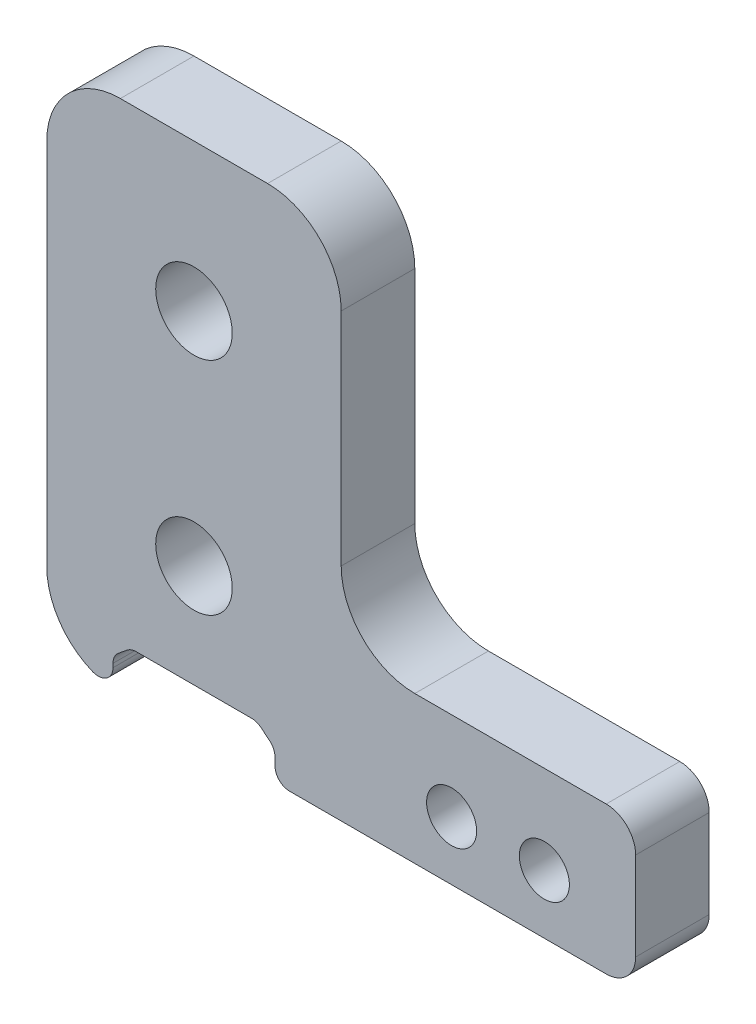
ISO-10303-21;
HEADER;
FILE_DESCRIPTION(('STEP AP214'),'2;1');
FILE_NAME('part.step','',(''),(''),'','','');
FILE_SCHEMA(('AUTOMOTIVE_DESIGN { 1 0 10303 214 1 1 1 1 }'));
ENDSEC;
DATA;
#1=APPLICATION_CONTEXT('core data for automotive mechanical design processes');
#2=APPLICATION_PROTOCOL_DEFINITION('international standard','automotive_design',2000,#1);
#3=PRODUCT_CONTEXT('',#1,'mechanical');
#4=PRODUCT('Part','Part','',(#3));
#5=PRODUCT_RELATED_PRODUCT_CATEGORY('part','',(#4));
#6=PRODUCT_DEFINITION_FORMATION('','',#4);
#7=PRODUCT_DEFINITION_CONTEXT('part definition',#1,'design');
#8=PRODUCT_DEFINITION('design','',#6,#7);
#9=PRODUCT_DEFINITION_SHAPE('','',#8);
#10=(LENGTH_UNIT() NAMED_UNIT(*) SI_UNIT(.MILLI.,.METRE.));
#11=(NAMED_UNIT(*) PLANE_ANGLE_UNIT() SI_UNIT($,.RADIAN.));
#12=(NAMED_UNIT(*) SI_UNIT($,.STERADIAN.) SOLID_ANGLE_UNIT());
#13=UNCERTAINTY_MEASURE_WITH_UNIT(LENGTH_MEASURE(1.E-05),#10,'distance_accuracy_value','');
#14=(GEOMETRIC_REPRESENTATION_CONTEXT(3) GLOBAL_UNCERTAINTY_ASSIGNED_CONTEXT((#13)) GLOBAL_UNIT_ASSIGNED_CONTEXT((#10,
#11,#12)) REPRESENTATION_CONTEXT('',''));
#15=CARTESIAN_POINT('',(0.,0.,0.));
#16=DIRECTION('',(0.,0.,1.));
#17=DIRECTION('',(1.,0.,0.));
#18=AXIS2_PLACEMENT_3D('',#15,#16,#17);
#19=CARTESIAN_POINT('',(0.,-35.,5.));
#20=DIRECTION('',(0.,1.,0.));
#21=DIRECTION('',(0.,0.,1.));
#22=AXIS2_PLACEMENT_3D('',#19,#20,#21);
#23=PLANE('',#22);
#24=DIRECTION('',(1.,0.,0.));
#25=VECTOR('',#24,1.);
#26=CARTESIAN_POINT('',(0.,-35.,0.));
#27=LINE('',#26,#25);
#28=CARTESIAN_POINT('',(16.5,-35.,0.));
#29=VERTEX_POINT('',#28);
#30=CARTESIAN_POINT('',(38.,-35.,0.));
#31=VERTEX_POINT('',#30);
#32=EDGE_CURVE('E224',#29,#31,#27,.T.);
#33=ORIENTED_EDGE('',*,*,#32,.T.);
#34=DIRECTION('',(0.,0.,-1.));
#35=VECTOR('',#34,1.);
#36=CARTESIAN_POINT('',(38.,-35.,5.));
#37=LINE('',#36,#35);
#38=CARTESIAN_POINT('',(38.,-35.,5.));
#39=VERTEX_POINT('',#38);
#40=EDGE_CURVE('E376',#31,#39,#37,.F.);
#41=ORIENTED_EDGE('',*,*,#40,.T.);
#42=DIRECTION('',(1.,0.,0.));
#43=VECTOR('',#42,1.);
#44=CARTESIAN_POINT('',(20.,-35.,5.));
#45=LINE('',#44,#43);
#46=CARTESIAN_POINT('',(16.5,-35.,5.));
#47=VERTEX_POINT('',#46);
#48=EDGE_CURVE('E255',#47,#39,#45,.T.);
#49=ORIENTED_EDGE('',*,*,#48,.F.);
#50=DIRECTION('',(0.,0.,-1.));
#51=VECTOR('',#50,1.);
#52=CARTESIAN_POINT('',(16.5,-35.,0.));
#53=LINE('',#52,#51);
#54=EDGE_CURVE('E231',#47,#29,#53,.T.);
#55=ORIENTED_EDGE('',*,*,#54,.T.);
#56=EDGE_LOOP('',(#33,#41,#49,#55));
#57=FACE_BOUND('',#56,.T.);
#58=ADVANCED_FACE('F43',(#57),#23,.F.);
#59=CARTESIAN_POINT('',(0.,0.,5.));
#60=DIRECTION('',(0.,1.,0.));
#61=DIRECTION('',(0.,0.,1.));
#62=AXIS2_PLACEMENT_3D('',#59,#60,#61);
#63=PLANE('',#62);
#64=DIRECTION('',(1.,0.,0.));
#65=VECTOR('',#64,1.);
#66=CARTESIAN_POINT('',(0.,0.,0.));
#67=LINE('',#66,#65);
#68=CARTESIAN_POINT('',(5.,0.,0.));
#69=VERTEX_POINT('',#68);
#70=CARTESIAN_POINT('',(15.,0.,0.));
#71=VERTEX_POINT('',#70);
#72=EDGE_CURVE('E434',#69,#71,#67,.T.);
#73=ORIENTED_EDGE('',*,*,#72,.F.);
#74=DIRECTION('',(0.,0.,-1.));
#75=VECTOR('',#74,1.);
#76=CARTESIAN_POINT('',(5.,0.,5.));
#77=LINE('',#76,#75);
#78=CARTESIAN_POINT('',(5.,0.,5.));
#79=VERTEX_POINT('',#78);
#80=EDGE_CURVE('E353',#69,#79,#77,.F.);
#81=ORIENTED_EDGE('',*,*,#80,.T.);
#82=DIRECTION('',(1.,0.,0.));
#83=VECTOR('',#82,1.);
#84=CARTESIAN_POINT('',(0.,0.,5.));
#85=LINE('',#84,#83);
#86=CARTESIAN_POINT('',(15.,0.,5.));
#87=VERTEX_POINT('',#86);
#88=EDGE_CURVE('E446',#79,#87,#85,.T.);
#89=ORIENTED_EDGE('',*,*,#88,.T.);
#90=DIRECTION('',(0.,0.,-1.));
#91=VECTOR('',#90,1.);
#92=CARTESIAN_POINT('',(15.,0.,5.));
#93=LINE('',#92,#91);
#94=EDGE_CURVE('E349',#87,#71,#93,.T.);
#95=ORIENTED_EDGE('',*,*,#94,.T.);
#96=EDGE_LOOP('',(#73,#81,#89,#95));
#97=FACE_BOUND('',#96,.T.);
#98=ADVANCED_FACE('F499',(#97),#63,.T.);
#99=CARTESIAN_POINT('',(0.,0.,5.));
#100=DIRECTION('',(1.,0.,0.));
#101=DIRECTION('',(0.,1.,0.));
#102=AXIS2_PLACEMENT_3D('',#99,#100,#101);
#103=PLANE('',#102);
#104=DIRECTION('',(0.,-1.,0.));
#105=VECTOR('',#104,1.);
#106=CARTESIAN_POINT('',(0.,0.,0.));
#107=LINE('',#106,#105);
#108=CARTESIAN_POINT('',(0.,-5.,0.));
#109=VERTEX_POINT('',#108);
#110=CARTESIAN_POINT('',(0.,-30.0250628144669,0.));
#111=VERTEX_POINT('',#110);
#112=EDGE_CURVE('E258',#109,#111,#107,.T.);
#113=ORIENTED_EDGE('',*,*,#112,.T.);
#114=DIRECTION('',(0.,0.,1.));
#115=VECTOR('',#114,1.);
#116=CARTESIAN_POINT('',(0.,-30.0250628144669,5.));
#117=LINE('',#116,#115);
#118=CARTESIAN_POINT('',(0.,-30.0250628144669,5.));
#119=VERTEX_POINT('',#118);
#120=EDGE_CURVE('E337',#111,#119,#117,.T.);
#121=ORIENTED_EDGE('',*,*,#120,.T.);
#122=DIRECTION('',(0.,-1.,0.));
#123=VECTOR('',#122,1.);
#124=CARTESIAN_POINT('',(0.,0.,5.));
#125=LINE('',#124,#123);
#126=CARTESIAN_POINT('',(0.,-5.,5.));
#127=VERTEX_POINT('',#126);
#128=EDGE_CURVE('E248',#127,#119,#125,.T.);
#129=ORIENTED_EDGE('',*,*,#128,.F.);
#130=DIRECTION('',(0.,0.,-1.));
#131=VECTOR('',#130,1.);
#132=CARTESIAN_POINT('',(0.,-5.,0.));
#133=LINE('',#132,#131);
#134=EDGE_CURVE('E333',#127,#109,#133,.T.);
#135=ORIENTED_EDGE('',*,*,#134,.T.);
#136=EDGE_LOOP('',(#113,#121,#129,#135));
#137=FACE_BOUND('',#136,.T.);
#138=ADVANCED_FACE('F485',(#137),#103,.F.);
#139=CARTESIAN_POINT('',(40.,-35.,5.));
#140=DIRECTION('',(-1.,0.,0.));
#141=DIRECTION('',(0.,0.,1.));
#142=AXIS2_PLACEMENT_3D('',#139,#140,#141);
#143=PLANE('',#142);
#144=DIRECTION('',(0.,1.,0.));
#145=VECTOR('',#144,1.);
#146=CARTESIAN_POINT('',(40.,-35.,5.));
#147=LINE('',#146,#145);
#148=CARTESIAN_POINT('',(40.,-33.,5.));
#149=VERTEX_POINT('',#148);
#150=CARTESIAN_POINT('',(40.,-27.,5.));
#151=VERTEX_POINT('',#150);
#152=EDGE_CURVE('E457',#149,#151,#147,.T.);
#153=ORIENTED_EDGE('',*,*,#152,.F.);
#154=DIRECTION('',(0.,0.,-1.));
#155=VECTOR('',#154,1.);
#156=CARTESIAN_POINT('',(40.,-33.,5.));
#157=LINE('',#156,#155);
#158=CARTESIAN_POINT('',(40.,-33.,0.));
#159=VERTEX_POINT('',#158);
#160=EDGE_CURVE('E366',#149,#159,#157,.T.);
#161=ORIENTED_EDGE('',*,*,#160,.T.);
#162=DIRECTION('',(0.,1.,0.));
#163=VECTOR('',#162,1.);
#164=CARTESIAN_POINT('',(40.,-35.,0.));
#165=LINE('',#164,#163);
#166=CARTESIAN_POINT('',(40.,-27.,0.));
#167=VERTEX_POINT('',#166);
#168=EDGE_CURVE('E474',#159,#167,#165,.T.);
#169=ORIENTED_EDGE('',*,*,#168,.T.);
#170=DIRECTION('',(0.,0.,-1.));
#171=VECTOR('',#170,1.);
#172=CARTESIAN_POINT('',(40.,-27.,5.));
#173=LINE('',#172,#171);
#174=EDGE_CURVE('E363',#167,#151,#173,.F.);
#175=ORIENTED_EDGE('',*,*,#174,.T.);
#176=EDGE_LOOP('',(#153,#161,#169,#175));
#177=FACE_BOUND('',#176,.T.);
#178=ADVANCED_FACE('F509',(#177),#143,.F.);
#179=CARTESIAN_POINT('',(40.,-25.,5.));
#180=DIRECTION('',(0.,-1.,0.));
#181=DIRECTION('',(1.,0.,0.));
#182=AXIS2_PLACEMENT_3D('',#179,#180,#181);
#183=PLANE('',#182);
#184=DIRECTION('',(-1.,0.,0.));
#185=VECTOR('',#184,1.);
#186=CARTESIAN_POINT('',(40.,-25.,5.));
#187=LINE('',#186,#185);
#188=CARTESIAN_POINT('',(38.,-25.,5.));
#189=VERTEX_POINT('',#188);
#190=CARTESIAN_POINT('',(25.,-25.,5.));
#191=VERTEX_POINT('',#190);
#192=EDGE_CURVE('E454',#189,#191,#187,.T.);
#193=ORIENTED_EDGE('',*,*,#192,.F.);
#194=DIRECTION('',(0.,0.,-1.));
#195=VECTOR('',#194,1.);
#196=CARTESIAN_POINT('',(38.,-25.,5.));
#197=LINE('',#196,#195);
#198=CARTESIAN_POINT('',(38.,-25.,0.));
#199=VERTEX_POINT('',#198);
#200=EDGE_CURVE('E385',#189,#199,#197,.T.);
#201=ORIENTED_EDGE('',*,*,#200,.T.);
#202=DIRECTION('',(-1.,0.,0.));
#203=VECTOR('',#202,1.);
#204=CARTESIAN_POINT('',(40.,-25.,0.));
#205=LINE('',#204,#203);
#206=CARTESIAN_POINT('',(25.,-25.,0.));
#207=VERTEX_POINT('',#206);
#208=EDGE_CURVE('E471',#199,#207,#205,.T.);
#209=ORIENTED_EDGE('',*,*,#208,.T.);
#210=DIRECTION('',(0.,0.,-1.));
#211=VECTOR('',#210,1.);
#212=CARTESIAN_POINT('',(25.,-25.,5.));
#213=LINE('',#212,#211);
#214=EDGE_CURVE('E320',#207,#191,#213,.F.);
#215=ORIENTED_EDGE('',*,*,#214,.T.);
#216=EDGE_LOOP('',(#193,#201,#209,#215));
#217=FACE_BOUND('',#216,.T.);
#218=ADVANCED_FACE('F512',(#217),#183,.F.);
#219=CARTESIAN_POINT('',(20.,0.,5.));
#220=DIRECTION('',(1.,0.,0.));
#221=DIRECTION('',(0.,1.,0.));
#222=AXIS2_PLACEMENT_3D('',#219,#220,#221);
#223=PLANE('',#222);
#224=DIRECTION('',(0.,-1.,0.));
#225=VECTOR('',#224,1.);
#226=CARTESIAN_POINT('',(20.,0.,5.));
#227=LINE('',#226,#225);
#228=CARTESIAN_POINT('',(20.,-5.,5.));
#229=VERTEX_POINT('',#228);
#230=CARTESIAN_POINT('',(20.,-20.,5.));
#231=VERTEX_POINT('',#230);
#232=EDGE_CURVE('E450',#229,#231,#227,.T.);
#233=ORIENTED_EDGE('',*,*,#232,.T.);
#234=DIRECTION('',(0.,0.,-1.));
#235=VECTOR('',#234,1.);
#236=CARTESIAN_POINT('',(20.,-20.,5.));
#237=LINE('',#236,#235);
#238=CARTESIAN_POINT('',(20.,-20.,0.));
#239=VERTEX_POINT('',#238);
#240=EDGE_CURVE('E316',#231,#239,#237,.T.);
#241=ORIENTED_EDGE('',*,*,#240,.T.);
#242=DIRECTION('',(0.,-1.,0.));
#243=VECTOR('',#242,1.);
#244=CARTESIAN_POINT('',(20.,0.,0.));
#245=LINE('',#244,#243);
#246=CARTESIAN_POINT('',(20.,-5.,0.));
#247=VERTEX_POINT('',#246);
#248=EDGE_CURVE('E467',#247,#239,#245,.T.);
#249=ORIENTED_EDGE('',*,*,#248,.F.);
#250=DIRECTION('',(0.,0.,-1.));
#251=VECTOR('',#250,1.);
#252=CARTESIAN_POINT('',(20.,-5.,5.));
#253=LINE('',#252,#251);
#254=EDGE_CURVE('E313',#247,#229,#253,.F.);
#255=ORIENTED_EDGE('',*,*,#254,.T.);
#256=EDGE_LOOP('',(#233,#241,#249,#255));
#257=FACE_BOUND('',#256,.T.);
#258=ADVANCED_FACE('F516',(#257),#223,.T.);
#259=CARTESIAN_POINT('',(0.,0.,5.));
#260=DIRECTION('',(0.,0.,-1.));
#261=DIRECTION('',(-1.,0.,0.));
#262=AXIS2_PLACEMENT_3D('',#259,#260,#261);
#263=PLANE('',#262);
#264=CARTESIAN_POINT('',(27.5,-31.,5.));
#265=DIRECTION('',(0.,0.,-1.));
#266=DIRECTION('',(-1.,0.,0.));
#267=AXIS2_PLACEMENT_3D('',#264,#265,#266);
#268=CIRCLE('',#267,1.7);
#269=CARTESIAN_POINT('',(25.8,-31.,5.));
#270=VERTEX_POINT('',#269);
#271=EDGE_CURVE('E418',#270,#270,#268,.F.);
#272=ORIENTED_EDGE('',*,*,#271,.F.);
#273=EDGE_LOOP('',(#272));
#274=FACE_BOUND('',#273,.T.);
#275=CARTESIAN_POINT('',(33.8,-31.,5.));
#276=DIRECTION('',(0.,0.,-1.));
#277=DIRECTION('',(-1.,0.,0.));
#278=AXIS2_PLACEMENT_3D('',#275,#276,#277);
#279=CIRCLE('',#278,1.7);
#280=CARTESIAN_POINT('',(32.1,-31.,5.));
#281=VERTEX_POINT('',#280);
#282=EDGE_CURVE('E419',#281,#281,#279,.F.);
#283=ORIENTED_EDGE('',*,*,#282,.F.);
#284=EDGE_LOOP('',(#283));
#285=FACE_BOUND('',#284,.T.);
#286=CARTESIAN_POINT('',(10.,-10.,5.));
#287=DIRECTION('',(0.,0.,-1.));
#288=DIRECTION('',(-1.,0.,0.));
#289=AXIS2_PLACEMENT_3D('',#286,#287,#288);
#290=CIRCLE('',#289,2.6);
#291=CARTESIAN_POINT('',(7.4,-10.,5.));
#292=VERTEX_POINT('',#291);
#293=EDGE_CURVE('E430',#292,#292,#290,.T.);
#294=ORIENTED_EDGE('',*,*,#293,.T.);
#295=EDGE_LOOP('',(#294));
#296=FACE_BOUND('',#295,.T.);
#297=CARTESIAN_POINT('',(10.,-25.,5.));
#298=DIRECTION('',(0.,0.,-1.));
#299=DIRECTION('',(-1.,0.,0.));
#300=AXIS2_PLACEMENT_3D('',#297,#298,#299);
#301=CIRCLE('',#300,2.6);
#302=CARTESIAN_POINT('',(7.4,-25.,5.));
#303=VERTEX_POINT('',#302);
#304=EDGE_CURVE('E423',#303,#303,#301,.T.);
#305=ORIENTED_EDGE('',*,*,#304,.T.);
#306=EDGE_LOOP('',(#305));
#307=FACE_BOUND('',#306,.T.);
#308=CARTESIAN_POINT('',(5.,-30.0250628144669,5.));
#309=DIRECTION('',(0.,0.,-1.));
#310=DIRECTION('',(-1.,0.,0.));
#311=AXIS2_PLACEMENT_3D('',#308,#309,#310);
#312=CIRCLE('',#311,5.);
#313=CARTESIAN_POINT('',(3.125,-34.6601868689017,5.));
#314=VERTEX_POINT('',#313);
#315=EDGE_CURVE('E346',#119,#314,#312,.F.);
#316=ORIENTED_EDGE('',*,*,#315,.T.);
#317=CARTESIAN_POINT('',(3.5,-33.7331620580147,5.));
#318=DIRECTION('',(0.,0.,-1.));
#319=DIRECTION('',(-1.,0.,0.));
#320=AXIS2_PLACEMENT_3D('',#317,#318,#319);
#321=CIRCLE('',#320,1.);
#322=CARTESIAN_POINT('',(4.5,-33.7331620580147,5.));
#323=VERTEX_POINT('',#322);
#324=EDGE_CURVE('E11',#314,#323,#321,.F.);
#325=ORIENTED_EDGE('',*,*,#324,.T.);
#326=DIRECTION('',(0.,-1.,0.));
#327=VECTOR('',#326,1.);
#328=CARTESIAN_POINT('',(4.5,-35.,5.));
#329=LINE('',#328,#327);
#330=CARTESIAN_POINT('',(4.5,-33.4749141008561,5.));
#331=VERTEX_POINT('',#330);
#332=EDGE_CURVE('E400',#331,#323,#329,.T.);
#333=ORIENTED_EDGE('',*,*,#332,.F.);
#334=CARTESIAN_POINT('',(5.5,-33.4749141008561,5.));
#335=DIRECTION('',(0.,0.,-1.));
#336=DIRECTION('',(-1.,0.,0.));
#337=AXIS2_PLACEMENT_3D('',#334,#335,#336);
#338=CIRCLE('',#337,1.);
#339=CARTESIAN_POINT('',(4.86807085347532,-32.6998879375735,5.));
#340=VERTEX_POINT('',#339);
#341=EDGE_CURVE('E310',#331,#340,#338,.T.);
#342=ORIENTED_EDGE('',*,*,#341,.T.);
#343=DIRECTION('',(-0.77502616328263,-0.631929146524677,0.));
#344=VECTOR('',#343,1.);
#345=CARTESIAN_POINT('',(4.5,-33.,5.));
#346=LINE('',#345,#344);
#347=CARTESIAN_POINT('',(5.45052674350594,-32.2249738367174,5.));
#348=VERTEX_POINT('',#347);
#349=EDGE_CURVE('E584',#348,#340,#346,.T.);
#350=ORIENTED_EDGE('',*,*,#349,.F.);
#351=CARTESIAN_POINT('',(6.08245589003062,-33.,5.));
#352=DIRECTION('',(0.,0.,-1.));
#353=DIRECTION('',(-1.,0.,0.));
#354=AXIS2_PLACEMENT_3D('',#351,#352,#353);
#355=CIRCLE('',#354,1.);
#356=CARTESIAN_POINT('',(6.08245589003062,-32.,5.));
#357=VERTEX_POINT('',#356);
#358=EDGE_CURVE('E303',#348,#357,#355,.T.);
#359=ORIENTED_EDGE('',*,*,#358,.T.);
#360=DIRECTION('',(-1.,0.,0.));
#361=VECTOR('',#360,1.);
#362=CARTESIAN_POINT('',(5.72644471701443,-32.,5.));
#363=LINE('',#362,#361);
#364=CARTESIAN_POINT('',(13.9175441099694,-32.,5.));
#365=VERTEX_POINT('',#364);
#366=EDGE_CURVE('E406',#365,#357,#363,.T.);
#367=ORIENTED_EDGE('',*,*,#366,.F.);
#368=CARTESIAN_POINT('',(13.9175441099694,-33.,5.));
#369=DIRECTION('',(0.,0.,-1.));
#370=DIRECTION('',(-1.,0.,0.));
#371=AXIS2_PLACEMENT_3D('',#368,#369,#370);
#372=CIRCLE('',#371,1.);
#373=CARTESIAN_POINT('',(14.549473256494,-32.2249738367174,5.));
#374=VERTEX_POINT('',#373);
#375=EDGE_CURVE('E297',#365,#374,#372,.T.);
#376=ORIENTED_EDGE('',*,*,#375,.T.);
#377=DIRECTION('',(-0.77502616328263,0.631929146524677,0.));
#378=VECTOR('',#377,1.);
#379=CARTESIAN_POINT('',(14.2735552829856,-32.,5.));
#380=LINE('',#379,#378);
#381=CARTESIAN_POINT('',(15.1319291465247,-32.6998879375735,5.));
#382=VERTEX_POINT('',#381);
#383=EDGE_CURVE('E585',#382,#374,#380,.T.);
#384=ORIENTED_EDGE('',*,*,#383,.F.);
#385=CARTESIAN_POINT('',(14.5,-33.4749141008561,5.));
#386=DIRECTION('',(0.,0.,-1.));
#387=DIRECTION('',(-1.,0.,0.));
#388=AXIS2_PLACEMENT_3D('',#385,#386,#387);
#389=CIRCLE('',#388,1.);
#390=CARTESIAN_POINT('',(15.5,-33.4749141008561,5.));
#391=VERTEX_POINT('',#390);
#392=EDGE_CURVE('E291',#382,#391,#389,.T.);
#393=ORIENTED_EDGE('',*,*,#392,.T.);
#394=DIRECTION('',(0.,-1.,0.));
#395=VECTOR('',#394,1.);
#396=CARTESIAN_POINT('',(15.5,-35.,5.));
#397=LINE('',#396,#395);
#398=CARTESIAN_POINT('',(15.5,-34.,5.));
#399=VERTEX_POINT('',#398);
#400=EDGE_CURVE('E580',#391,#399,#397,.T.);
#401=ORIENTED_EDGE('',*,*,#400,.T.);
#402=CARTESIAN_POINT('',(16.5,-34.,5.));
#403=DIRECTION('',(0.,0.,-1.));
#404=DIRECTION('',(-1.,0.,0.));
#405=AXIS2_PLACEMENT_3D('',#402,#403,#404);
#406=CIRCLE('',#405,1.);
#407=EDGE_CURVE('E230',#399,#47,#406,.F.);
#408=ORIENTED_EDGE('',*,*,#407,.T.);
#409=ORIENTED_EDGE('',*,*,#48,.T.);
#410=CARTESIAN_POINT('',(38.,-33.,5.));
#411=DIRECTION('',(0.,0.,-1.));
#412=DIRECTION('',(-1.,0.,0.));
#413=AXIS2_PLACEMENT_3D('',#410,#411,#412);
#414=CIRCLE('',#413,2.);
#415=EDGE_CURVE('E382',#39,#149,#414,.F.);
#416=ORIENTED_EDGE('',*,*,#415,.T.);
#417=ORIENTED_EDGE('',*,*,#152,.T.);
#418=CARTESIAN_POINT('',(38.,-27.,5.));
#419=DIRECTION('',(0.,0.,-1.));
#420=DIRECTION('',(-1.,0.,0.));
#421=AXIS2_PLACEMENT_3D('',#418,#419,#420);
#422=CIRCLE('',#421,2.);
#423=EDGE_CURVE('E379',#151,#189,#422,.F.);
#424=ORIENTED_EDGE('',*,*,#423,.T.);
#425=ORIENTED_EDGE('',*,*,#192,.T.);
#426=CARTESIAN_POINT('',(25.,-20.,5.));
#427=DIRECTION('',(0.,0.,-1.));
#428=DIRECTION('',(-1.,0.,0.));
#429=AXIS2_PLACEMENT_3D('',#426,#427,#428);
#430=CIRCLE('',#429,5.);
#431=EDGE_CURVE('E360',#191,#231,#430,.T.);
#432=ORIENTED_EDGE('',*,*,#431,.T.);
#433=ORIENTED_EDGE('',*,*,#232,.F.);
#434=CARTESIAN_POINT('',(15.,-5.,5.));
#435=DIRECTION('',(0.,0.,-1.));
#436=DIRECTION('',(-1.,0.,0.));
#437=AXIS2_PLACEMENT_3D('',#434,#435,#436);
#438=CIRCLE('',#437,5.);
#439=EDGE_CURVE('E340',#229,#87,#438,.F.);
#440=ORIENTED_EDGE('',*,*,#439,.T.);
#441=ORIENTED_EDGE('',*,*,#88,.F.);
#442=CARTESIAN_POINT('',(5.,-5.,5.));
#443=DIRECTION('',(0.,0.,-1.));
#444=DIRECTION('',(-1.,0.,0.));
#445=AXIS2_PLACEMENT_3D('',#442,#443,#444);
#446=CIRCLE('',#445,5.);
#447=EDGE_CURVE('E343',#79,#127,#446,.F.);
#448=ORIENTED_EDGE('',*,*,#447,.T.);
#449=ORIENTED_EDGE('',*,*,#128,.T.);
#450=EDGE_LOOP('',(#316,#325,#333,#342,#350,#359,#367,#376,#384,#393,#401,#408,#409,#416,#417,
#424,#425,#432,#433,#440,#441,#448,#449));
#451=FACE_BOUND('',#450,.T.);
#452=ADVANCED_FACE('F490',(#274,#285,#296,#307,#451),#263,.F.);
#453=CARTESIAN_POINT('',(0.,0.,0.));
#454=DIRECTION('',(0.,0.,-1.));
#455=DIRECTION('',(-1.,0.,0.));
#456=AXIS2_PLACEMENT_3D('',#453,#454,#455);
#457=PLANE('',#456);
#458=DIRECTION('',(0.,1.,0.));
#459=VECTOR('',#458,1.);
#460=CARTESIAN_POINT('',(4.5,-35.,0.));
#461=LINE('',#460,#459);
#462=CARTESIAN_POINT('',(4.5,-33.7331620580147,0.));
#463=VERTEX_POINT('',#462);
#464=CARTESIAN_POINT('',(4.5,-33.4749141008561,0.));
#465=VERTEX_POINT('',#464);
#466=EDGE_CURVE('E242',#463,#465,#461,.T.);
#467=ORIENTED_EDGE('',*,*,#466,.F.);
#468=CARTESIAN_POINT('',(3.5,-33.7331620580147,0.));
#469=DIRECTION('',(0.,0.,-1.));
#470=DIRECTION('',(-1.,0.,0.));
#471=AXIS2_PLACEMENT_3D('',#468,#469,#470);
#472=CIRCLE('',#471,1.);
#473=CARTESIAN_POINT('',(3.125,-34.6601868689017,0.));
#474=VERTEX_POINT('',#473);
#475=EDGE_CURVE('E70',#463,#474,#472,.T.);
#476=ORIENTED_EDGE('',*,*,#475,.T.);
#477=CARTESIAN_POINT('',(5.,-30.0250628144669,0.));
#478=DIRECTION('',(0.,0.,-1.));
#479=DIRECTION('',(-1.,0.,0.));
#480=AXIS2_PLACEMENT_3D('',#477,#478,#479);
#481=CIRCLE('',#480,5.);
#482=EDGE_CURVE('E330',#474,#111,#481,.T.);
#483=ORIENTED_EDGE('',*,*,#482,.T.);
#484=ORIENTED_EDGE('',*,*,#112,.F.);
#485=CARTESIAN_POINT('',(5.,-5.,0.));
#486=DIRECTION('',(0.,0.,-1.));
#487=DIRECTION('',(-1.,0.,0.));
#488=AXIS2_PLACEMENT_3D('',#485,#486,#487);
#489=CIRCLE('',#488,5.);
#490=EDGE_CURVE('E327',#109,#69,#489,.T.);
#491=ORIENTED_EDGE('',*,*,#490,.T.);
#492=ORIENTED_EDGE('',*,*,#72,.T.);
#493=CARTESIAN_POINT('',(15.,-5.,0.));
#494=DIRECTION('',(0.,0.,-1.));
#495=DIRECTION('',(-1.,0.,0.));
#496=AXIS2_PLACEMENT_3D('',#493,#494,#495);
#497=CIRCLE('',#496,5.);
#498=EDGE_CURVE('E324',#71,#247,#497,.T.);
#499=ORIENTED_EDGE('',*,*,#498,.T.);
#500=ORIENTED_EDGE('',*,*,#248,.T.);
#501=CARTESIAN_POINT('',(25.,-20.,0.));
#502=DIRECTION('',(0.,0.,-1.));
#503=DIRECTION('',(-1.,0.,0.));
#504=AXIS2_PLACEMENT_3D('',#501,#502,#503);
#505=CIRCLE('',#504,5.);
#506=EDGE_CURVE('E356',#239,#207,#505,.F.);
#507=ORIENTED_EDGE('',*,*,#506,.T.);
#508=ORIENTED_EDGE('',*,*,#208,.F.);
#509=CARTESIAN_POINT('',(38.,-27.,0.));
#510=DIRECTION('',(0.,0.,-1.));
#511=DIRECTION('',(-1.,0.,0.));
#512=AXIS2_PLACEMENT_3D('',#509,#510,#511);
#513=CIRCLE('',#512,2.);
#514=EDGE_CURVE('E370',#199,#167,#513,.T.);
#515=ORIENTED_EDGE('',*,*,#514,.T.);
#516=ORIENTED_EDGE('',*,*,#168,.F.);
#517=CARTESIAN_POINT('',(38.,-33.,0.));
#518=DIRECTION('',(0.,0.,-1.));
#519=DIRECTION('',(-1.,0.,0.));
#520=AXIS2_PLACEMENT_3D('',#517,#518,#519);
#521=CIRCLE('',#520,2.);
#522=EDGE_CURVE('E373',#159,#31,#521,.T.);
#523=ORIENTED_EDGE('',*,*,#522,.T.);
#524=ORIENTED_EDGE('',*,*,#32,.F.);
#525=CARTESIAN_POINT('',(16.5,-34.,0.));
#526=DIRECTION('',(0.,0.,-1.));
#527=DIRECTION('',(-1.,0.,0.));
#528=AXIS2_PLACEMENT_3D('',#525,#526,#527);
#529=CIRCLE('',#528,1.);
#530=CARTESIAN_POINT('',(15.5,-34.,0.));
#531=VERTEX_POINT('',#530);
#532=EDGE_CURVE('E218',#29,#531,#529,.T.);
#533=ORIENTED_EDGE('',*,*,#532,.T.);
#534=DIRECTION('',(0.,1.,0.));
#535=VECTOR('',#534,1.);
#536=CARTESIAN_POINT('',(15.5,-35.,0.));
#537=LINE('',#536,#535);
#538=CARTESIAN_POINT('',(15.5,-33.4749141008561,0.));
#539=VERTEX_POINT('',#538);
#540=EDGE_CURVE('E222',#531,#539,#537,.T.);
#541=ORIENTED_EDGE('',*,*,#540,.T.);
#542=CARTESIAN_POINT('',(14.5,-33.4749141008561,0.));
#543=DIRECTION('',(0.,0.,-1.));
#544=DIRECTION('',(-1.,0.,0.));
#545=AXIS2_PLACEMENT_3D('',#542,#543,#544);
#546=CIRCLE('',#545,1.);
#547=CARTESIAN_POINT('',(15.1319291465247,-32.6998879375735,0.));
#548=VERTEX_POINT('',#547);
#549=EDGE_CURVE('E288',#539,#548,#546,.F.);
#550=ORIENTED_EDGE('',*,*,#549,.T.);
#551=DIRECTION('',(0.77502616328263,-0.631929146524677,0.));
#552=VECTOR('',#551,1.);
#553=CARTESIAN_POINT('',(14.2735552829856,-32.,0.));
#554=LINE('',#553,#552);
#555=CARTESIAN_POINT('',(14.549473256494,-32.2249738367174,0.));
#556=VERTEX_POINT('',#555);
#557=EDGE_CURVE('E243',#556,#548,#554,.T.);
#558=ORIENTED_EDGE('',*,*,#557,.F.);
#559=CARTESIAN_POINT('',(13.9175441099694,-33.,0.));
#560=DIRECTION('',(0.,0.,-1.));
#561=DIRECTION('',(-1.,0.,0.));
#562=AXIS2_PLACEMENT_3D('',#559,#560,#561);
#563=CIRCLE('',#562,1.);
#564=CARTESIAN_POINT('',(13.9175441099694,-32.,0.));
#565=VERTEX_POINT('',#564);
#566=EDGE_CURVE('E294',#556,#565,#563,.F.);
#567=ORIENTED_EDGE('',*,*,#566,.T.);
#568=DIRECTION('',(1.,0.,0.));
#569=VECTOR('',#568,1.);
#570=CARTESIAN_POINT('',(5.72644471701443,-32.,0.));
#571=LINE('',#570,#569);
#572=CARTESIAN_POINT('',(6.08245589003062,-32.,0.));
#573=VERTEX_POINT('',#572);
#574=EDGE_CURVE('E600',#573,#565,#571,.T.);
#575=ORIENTED_EDGE('',*,*,#574,.F.);
#576=CARTESIAN_POINT('',(6.08245589003062,-33.,0.));
#577=DIRECTION('',(0.,0.,-1.));
#578=DIRECTION('',(-1.,0.,0.));
#579=AXIS2_PLACEMENT_3D('',#576,#577,#578);
#580=CIRCLE('',#579,1.);
#581=CARTESIAN_POINT('',(5.45052674350594,-32.2249738367174,0.));
#582=VERTEX_POINT('',#581);
#583=EDGE_CURVE('E300',#573,#582,#580,.F.);
#584=ORIENTED_EDGE('',*,*,#583,.T.);
#585=DIRECTION('',(0.77502616328263,0.631929146524677,0.));
#586=VECTOR('',#585,1.);
#587=CARTESIAN_POINT('',(4.5,-33.,0.));
#588=LINE('',#587,#586);
#589=CARTESIAN_POINT('',(4.86807085347532,-32.6998879375735,0.));
#590=VERTEX_POINT('',#589);
#591=EDGE_CURVE('E596',#590,#582,#588,.T.);
#592=ORIENTED_EDGE('',*,*,#591,.F.);
#593=CARTESIAN_POINT('',(5.5,-33.4749141008561,0.));
#594=DIRECTION('',(0.,0.,-1.));
#595=DIRECTION('',(-1.,0.,0.));
#596=AXIS2_PLACEMENT_3D('',#593,#594,#595);
#597=CIRCLE('',#596,1.);
#598=EDGE_CURVE('E306',#590,#465,#597,.F.);
#599=ORIENTED_EDGE('',*,*,#598,.T.);
#600=EDGE_LOOP('',(#467,#476,#483,#484,#491,#492,#499,#500,#507,#508,#515,#516,#523,#524,#533,
#541,#550,#558,#567,#575,#584,#592,#599));
#601=FACE_BOUND('',#600,.T.);
#602=CARTESIAN_POINT('',(27.5,-31.,0.));
#603=DIRECTION('',(0.,0.,-1.));
#604=DIRECTION('',(-1.,0.,0.));
#605=AXIS2_PLACEMENT_3D('',#602,#603,#604);
#606=CIRCLE('',#605,1.7);
#607=CARTESIAN_POINT('',(25.8,-31.,0.));
#608=VERTEX_POINT('',#607);
#609=EDGE_CURVE('E414',#608,#608,#606,.T.);
#610=ORIENTED_EDGE('',*,*,#609,.F.);
#611=EDGE_LOOP('',(#610));
#612=FACE_BOUND('',#611,.T.);
#613=CARTESIAN_POINT('',(33.8,-31.,0.));
#614=DIRECTION('',(0.,0.,-1.));
#615=DIRECTION('',(-1.,0.,0.));
#616=AXIS2_PLACEMENT_3D('',#613,#614,#615);
#617=CIRCLE('',#616,1.7);
#618=CARTESIAN_POINT('',(32.1,-31.,0.));
#619=VERTEX_POINT('',#618);
#620=EDGE_CURVE('E410',#619,#619,#617,.T.);
#621=ORIENTED_EDGE('',*,*,#620,.F.);
#622=EDGE_LOOP('',(#621));
#623=FACE_BOUND('',#622,.T.);
#624=CARTESIAN_POINT('',(10.,-10.,0.));
#625=DIRECTION('',(0.,0.,-1.));
#626=DIRECTION('',(-1.,0.,0.));
#627=AXIS2_PLACEMENT_3D('',#624,#625,#626);
#628=CIRCLE('',#627,2.6);
#629=CARTESIAN_POINT('',(7.4,-10.,0.));
#630=VERTEX_POINT('',#629);
#631=EDGE_CURVE('E435',#630,#630,#628,.T.);
#632=ORIENTED_EDGE('',*,*,#631,.F.);
#633=EDGE_LOOP('',(#632));
#634=FACE_BOUND('',#633,.T.);
#635=CARTESIAN_POINT('',(10.,-25.,0.));
#636=DIRECTION('',(0.,0.,-1.));
#637=DIRECTION('',(-1.,0.,0.));
#638=AXIS2_PLACEMENT_3D('',#635,#636,#637);
#639=CIRCLE('',#638,2.6);
#640=CARTESIAN_POINT('',(7.4,-25.,0.));
#641=VERTEX_POINT('',#640);
#642=EDGE_CURVE('E439',#641,#641,#639,.T.);
#643=ORIENTED_EDGE('',*,*,#642,.F.);
#644=EDGE_LOOP('',(#643));
#645=FACE_BOUND('',#644,.T.);
#646=ADVANCED_FACE('F220',(#601,#612,#623,#634,#645),#457,.T.);
#647=CARTESIAN_POINT('',(10.,-25.,5.));
#648=DIRECTION('',(0.,0.,-1.));
#649=DIRECTION('',(-1.,0.,0.));
#650=AXIS2_PLACEMENT_3D('',#647,#648,#649);
#651=CYLINDRICAL_SURFACE('',#650,2.6);
#652=ORIENTED_EDGE('',*,*,#304,.F.);
#653=EDGE_LOOP('',(#652));
#654=FACE_BOUND('',#653,.T.);
#655=ORIENTED_EDGE('',*,*,#642,.T.);
#656=EDGE_LOOP('',(#655));
#657=FACE_BOUND('',#656,.T.);
#658=ADVANCED_FACE('F643',(#654,#657),#651,.F.);
#659=CARTESIAN_POINT('',(10.,-10.,5.));
#660=DIRECTION('',(0.,0.,-1.));
#661=DIRECTION('',(-1.,0.,0.));
#662=AXIS2_PLACEMENT_3D('',#659,#660,#661);
#663=CYLINDRICAL_SURFACE('',#662,2.6);
#664=ORIENTED_EDGE('',*,*,#293,.F.);
#665=EDGE_LOOP('',(#664));
#666=FACE_BOUND('',#665,.T.);
#667=ORIENTED_EDGE('',*,*,#631,.T.);
#668=EDGE_LOOP('',(#667));
#669=FACE_BOUND('',#668,.T.);
#670=ADVANCED_FACE('F639',(#666,#669),#663,.F.);
#671=CARTESIAN_POINT('',(33.8,-31.,5.001));
#672=DIRECTION('',(0.,0.,-1.));
#673=DIRECTION('',(-1.,0.,0.));
#674=AXIS2_PLACEMENT_3D('',#671,#672,#673);
#675=CYLINDRICAL_SURFACE('',#674,1.7);
#676=ORIENTED_EDGE('',*,*,#620,.T.);
#677=EDGE_LOOP('',(#676));
#678=FACE_BOUND('',#677,.T.);
#679=ORIENTED_EDGE('',*,*,#282,.T.);
#680=EDGE_LOOP('',(#679));
#681=FACE_BOUND('',#680,.T.);
#682=ADVANCED_FACE('F631',(#678,#681),#675,.F.);
#683=CARTESIAN_POINT('',(27.5,-31.,5.001));
#684=DIRECTION('',(0.,0.,-1.));
#685=DIRECTION('',(-1.,0.,0.));
#686=AXIS2_PLACEMENT_3D('',#683,#684,#685);
#687=CYLINDRICAL_SURFACE('',#686,1.7);
#688=ORIENTED_EDGE('',*,*,#609,.T.);
#689=EDGE_LOOP('',(#688));
#690=FACE_BOUND('',#689,.T.);
#691=ORIENTED_EDGE('',*,*,#271,.T.);
#692=EDGE_LOOP('',(#691));
#693=FACE_BOUND('',#692,.T.);
#694=ADVANCED_FACE('F624',(#690,#693),#687,.F.);
#695=CARTESIAN_POINT('',(4.5,-33.,5.001));
#696=DIRECTION('',(-0.631929146524677,0.77502616328263,0.));
#697=DIRECTION('',(-0.77502616328263,-0.631929146524677,0.));
#698=AXIS2_PLACEMENT_3D('',#695,#696,#697);
#699=PLANE('',#698);
#700=ORIENTED_EDGE('',*,*,#591,.T.);
#701=DIRECTION('',(0.,0.,-1.));
#702=VECTOR('',#701,1.);
#703=CARTESIAN_POINT('',(5.45052674350594,-32.2249738367174,5.));
#704=LINE('',#703,#702);
#705=EDGE_CURVE('E278',#582,#348,#704,.F.);
#706=ORIENTED_EDGE('',*,*,#705,.T.);
#707=ORIENTED_EDGE('',*,*,#349,.T.);
#708=DIRECTION('',(0.,0.,-1.));
#709=VECTOR('',#708,1.);
#710=CARTESIAN_POINT('',(4.86807085347532,-32.6998879375735,0.));
#711=LINE('',#710,#709);
#712=EDGE_CURVE('E274',#340,#590,#711,.T.);
#713=ORIENTED_EDGE('',*,*,#712,.T.);
#714=EDGE_LOOP('',(#700,#706,#707,#713));
#715=FACE_BOUND('',#714,.T.);
#716=ADVANCED_FACE('F620',(#715),#699,.F.);
#717=CARTESIAN_POINT('',(4.5,-35.,5.001));
#718=DIRECTION('',(-1.,0.,0.));
#719=DIRECTION('',(0.,-1.,0.));
#720=AXIS2_PLACEMENT_3D('',#717,#718,#719);
#721=PLANE('',#720);
#722=ORIENTED_EDGE('',*,*,#332,.T.);
#723=DIRECTION('',(0.,0.,-1.));
#724=VECTOR('',#723,1.);
#725=CARTESIAN_POINT('',(4.5,-33.7331620580147,0.));
#726=LINE('',#725,#724);
#727=EDGE_CURVE('E389',#323,#463,#726,.T.);
#728=ORIENTED_EDGE('',*,*,#727,.T.);
#729=ORIENTED_EDGE('',*,*,#466,.T.);
#730=DIRECTION('',(0.,0.,-1.));
#731=VECTOR('',#730,1.);
#732=CARTESIAN_POINT('',(4.5,-33.4749141008561,5.));
#733=LINE('',#732,#731);
#734=EDGE_CURVE('E281',#465,#331,#733,.F.);
#735=ORIENTED_EDGE('',*,*,#734,.T.);
#736=EDGE_LOOP('',(#722,#728,#729,#735));
#737=FACE_BOUND('',#736,.T.);
#738=ADVANCED_FACE('F398',(#737),#721,.F.);
#739=CARTESIAN_POINT('',(15.5,-35.,5.001));
#740=DIRECTION('',(-1.,0.,0.));
#741=DIRECTION('',(0.,0.,1.));
#742=AXIS2_PLACEMENT_3D('',#739,#740,#741);
#743=PLANE('',#742);
#744=ORIENTED_EDGE('',*,*,#400,.F.);
#745=DIRECTION('',(0.,0.,-1.));
#746=VECTOR('',#745,1.);
#747=CARTESIAN_POINT('',(15.5,-33.4749141008561,5.001));
#748=LINE('',#747,#746);
#749=EDGE_CURVE('E240',#391,#539,#748,.T.);
#750=ORIENTED_EDGE('',*,*,#749,.T.);
#751=ORIENTED_EDGE('',*,*,#540,.F.);
#752=DIRECTION('',(0.,0.,-1.));
#753=VECTOR('',#752,1.);
#754=CARTESIAN_POINT('',(15.5,-34.,5.));
#755=LINE('',#754,#753);
#756=EDGE_CURVE('E237',#531,#399,#755,.F.);
#757=ORIENTED_EDGE('',*,*,#756,.T.);
#758=EDGE_LOOP('',(#744,#750,#751,#757));
#759=FACE_BOUND('',#758,.T.);
#760=ADVANCED_FACE('F236',(#759),#743,.T.);
#761=CARTESIAN_POINT('',(14.2735552829856,-32.,5.001));
#762=DIRECTION('',(0.631929146524677,0.77502616328263,0.));
#763=DIRECTION('',(-0.77502616328263,0.631929146524677,0.));
#764=AXIS2_PLACEMENT_3D('',#761,#762,#763);
#765=PLANE('',#764);
#766=ORIENTED_EDGE('',*,*,#557,.T.);
#767=DIRECTION('',(0.,0.,-1.));
#768=VECTOR('',#767,1.);
#769=CARTESIAN_POINT('',(15.1319291465247,-32.6998879375735,5.001));
#770=LINE('',#769,#768);
#771=EDGE_CURVE('E264',#548,#382,#770,.F.);
#772=ORIENTED_EDGE('',*,*,#771,.T.);
#773=ORIENTED_EDGE('',*,*,#383,.T.);
#774=DIRECTION('',(0.,0.,-1.));
#775=VECTOR('',#774,1.);
#776=CARTESIAN_POINT('',(14.549473256494,-32.2249738367174,0.));
#777=LINE('',#776,#775);
#778=EDGE_CURVE('E252',#374,#556,#777,.T.);
#779=ORIENTED_EDGE('',*,*,#778,.T.);
#780=EDGE_LOOP('',(#766,#772,#773,#779));
#781=FACE_BOUND('',#780,.T.);
#782=ADVANCED_FACE('F608',(#781),#765,.F.);
#783=CARTESIAN_POINT('',(5.72644471701443,-32.,5.001));
#784=DIRECTION('',(0.,1.,0.));
#785=DIRECTION('',(0.,0.,1.));
#786=AXIS2_PLACEMENT_3D('',#783,#784,#785);
#787=PLANE('',#786);
#788=ORIENTED_EDGE('',*,*,#574,.T.);
#789=DIRECTION('',(0.,0.,-1.));
#790=VECTOR('',#789,1.);
#791=CARTESIAN_POINT('',(13.9175441099694,-32.,5.));
#792=LINE('',#791,#790);
#793=EDGE_CURVE('E271',#565,#365,#792,.F.);
#794=ORIENTED_EDGE('',*,*,#793,.T.);
#795=ORIENTED_EDGE('',*,*,#366,.T.);
#796=DIRECTION('',(0.,0.,-1.));
#797=VECTOR('',#796,1.);
#798=CARTESIAN_POINT('',(6.08245589003062,-32.,0.));
#799=LINE('',#798,#797);
#800=EDGE_CURVE('E267',#357,#573,#799,.T.);
#801=ORIENTED_EDGE('',*,*,#800,.T.);
#802=EDGE_LOOP('',(#788,#794,#795,#801));
#803=FACE_BOUND('',#802,.T.);
#804=ADVANCED_FACE('F525',(#803),#787,.F.);
#805=CARTESIAN_POINT('',(14.5,-33.4749141008561,5.001));
#806=DIRECTION('',(0.,0.,-1.));
#807=DIRECTION('',(-1.,0.,0.));
#808=AXIS2_PLACEMENT_3D('',#805,#806,#807);
#809=CYLINDRICAL_SURFACE('',#808,1.);
#810=ORIENTED_EDGE('',*,*,#392,.F.);
#811=ORIENTED_EDGE('',*,*,#771,.F.);
#812=ORIENTED_EDGE('',*,*,#549,.F.);
#813=ORIENTED_EDGE('',*,*,#749,.F.);
#814=EDGE_LOOP('',(#810,#811,#812,#813));
#815=FACE_BOUND('',#814,.T.);
#816=ADVANCED_FACE('F521',(#815),#809,.F.);
#817=CARTESIAN_POINT('',(13.9175441099694,-33.,5.001));
#818=DIRECTION('',(0.,0.,1.));
#819=DIRECTION('',(1.,0.,0.));
#820=AXIS2_PLACEMENT_3D('',#817,#818,#819);
#821=CYLINDRICAL_SURFACE('',#820,1.);
#822=ORIENTED_EDGE('',*,*,#375,.F.);
#823=ORIENTED_EDGE('',*,*,#793,.F.);
#824=ORIENTED_EDGE('',*,*,#566,.F.);
#825=ORIENTED_EDGE('',*,*,#778,.F.);
#826=EDGE_LOOP('',(#822,#823,#824,#825));
#827=FACE_BOUND('',#826,.T.);
#828=ADVANCED_FACE('F524',(#827),#821,.F.);
#829=CARTESIAN_POINT('',(6.08245589003062,-33.,5.001));
#830=DIRECTION('',(0.,0.,1.));
#831=DIRECTION('',(1.,0.,0.));
#832=AXIS2_PLACEMENT_3D('',#829,#830,#831);
#833=CYLINDRICAL_SURFACE('',#832,1.);
#834=ORIENTED_EDGE('',*,*,#358,.F.);
#835=ORIENTED_EDGE('',*,*,#705,.F.);
#836=ORIENTED_EDGE('',*,*,#583,.F.);
#837=ORIENTED_EDGE('',*,*,#800,.F.);
#838=EDGE_LOOP('',(#834,#835,#836,#837));
#839=FACE_BOUND('',#838,.T.);
#840=ADVANCED_FACE('F529',(#839),#833,.F.);
#841=CARTESIAN_POINT('',(5.5,-33.4749141008561,5.001));
#842=DIRECTION('',(0.,0.,1.));
#843=DIRECTION('',(1.,0.,0.));
#844=AXIS2_PLACEMENT_3D('',#841,#842,#843);
#845=CYLINDRICAL_SURFACE('',#844,1.);
#846=ORIENTED_EDGE('',*,*,#341,.F.);
#847=ORIENTED_EDGE('',*,*,#734,.F.);
#848=ORIENTED_EDGE('',*,*,#598,.F.);
#849=ORIENTED_EDGE('',*,*,#712,.F.);
#850=EDGE_LOOP('',(#846,#847,#848,#849));
#851=FACE_BOUND('',#850,.T.);
#852=ADVANCED_FACE('F533',(#851),#845,.F.);
#853=CARTESIAN_POINT('',(16.5,-34.,5.));
#854=DIRECTION('',(0.,0.,1.));
#855=DIRECTION('',(1.,0.,0.));
#856=AXIS2_PLACEMENT_3D('',#853,#854,#855);
#857=CYLINDRICAL_SURFACE('',#856,1.);
#858=ORIENTED_EDGE('',*,*,#407,.F.);
#859=ORIENTED_EDGE('',*,*,#756,.F.);
#860=ORIENTED_EDGE('',*,*,#532,.F.);
#861=ORIENTED_EDGE('',*,*,#54,.F.);
#862=EDGE_LOOP('',(#858,#859,#860,#861));
#863=FACE_BOUND('',#862,.T.);
#864=ADVANCED_FACE('F246',(#863),#857,.T.);
#865=CARTESIAN_POINT('',(25.,-20.,5.));
#866=DIRECTION('',(0.,0.,-1.));
#867=DIRECTION('',(-1.,0.,0.));
#868=AXIS2_PLACEMENT_3D('',#865,#866,#867);
#869=CYLINDRICAL_SURFACE('',#868,5.);
#870=ORIENTED_EDGE('',*,*,#431,.F.);
#871=ORIENTED_EDGE('',*,*,#214,.F.);
#872=ORIENTED_EDGE('',*,*,#506,.F.);
#873=ORIENTED_EDGE('',*,*,#240,.F.);
#874=EDGE_LOOP('',(#870,#871,#872,#873));
#875=FACE_BOUND('',#874,.T.);
#876=ADVANCED_FACE('F540',(#875),#869,.F.);
#877=CARTESIAN_POINT('',(5.,-30.0250628144669,5.));
#878=DIRECTION('',(0.,0.,1.));
#879=DIRECTION('',(1.,0.,0.));
#880=AXIS2_PLACEMENT_3D('',#877,#878,#879);
#881=CYLINDRICAL_SURFACE('',#880,5.);
#882=ORIENTED_EDGE('',*,*,#482,.F.);
#883=DIRECTION('',(0.,0.,1.));
#884=VECTOR('',#883,1.);
#885=CARTESIAN_POINT('',(3.125,-34.6601868689017,5.));
#886=LINE('',#885,#884);
#887=EDGE_CURVE('E52',#474,#314,#886,.T.);
#888=ORIENTED_EDGE('',*,*,#887,.T.);
#889=ORIENTED_EDGE('',*,*,#315,.F.);
#890=ORIENTED_EDGE('',*,*,#120,.F.);
#891=EDGE_LOOP('',(#882,#888,#889,#890));
#892=FACE_BOUND('',#891,.T.);
#893=ADVANCED_FACE('F488',(#892),#881,.T.);
#894=CARTESIAN_POINT('',(5.,-5.,5.));
#895=DIRECTION('',(0.,0.,1.));
#896=DIRECTION('',(1.,0.,0.));
#897=AXIS2_PLACEMENT_3D('',#894,#895,#896);
#898=CYLINDRICAL_SURFACE('',#897,5.);
#899=ORIENTED_EDGE('',*,*,#447,.F.);
#900=ORIENTED_EDGE('',*,*,#80,.F.);
#901=ORIENTED_EDGE('',*,*,#490,.F.);
#902=ORIENTED_EDGE('',*,*,#134,.F.);
#903=EDGE_LOOP('',(#899,#900,#901,#902));
#904=FACE_BOUND('',#903,.T.);
#905=ADVANCED_FACE('F546',(#904),#898,.T.);
#906=CARTESIAN_POINT('',(15.,-5.,5.));
#907=DIRECTION('',(0.,0.,-1.));
#908=DIRECTION('',(-1.,0.,0.));
#909=AXIS2_PLACEMENT_3D('',#906,#907,#908);
#910=CYLINDRICAL_SURFACE('',#909,5.);
#911=ORIENTED_EDGE('',*,*,#439,.F.);
#912=ORIENTED_EDGE('',*,*,#254,.F.);
#913=ORIENTED_EDGE('',*,*,#498,.F.);
#914=ORIENTED_EDGE('',*,*,#94,.F.);
#915=EDGE_LOOP('',(#911,#912,#913,#914));
#916=FACE_BOUND('',#915,.T.);
#917=ADVANCED_FACE('F549',(#916),#910,.T.);
#918=CARTESIAN_POINT('',(38.,-33.,5.));
#919=DIRECTION('',(0.,0.,-1.));
#920=DIRECTION('',(-1.,0.,0.));
#921=AXIS2_PLACEMENT_3D('',#918,#919,#920);
#922=CYLINDRICAL_SURFACE('',#921,2.);
#923=ORIENTED_EDGE('',*,*,#415,.F.);
#924=ORIENTED_EDGE('',*,*,#40,.F.);
#925=ORIENTED_EDGE('',*,*,#522,.F.);
#926=ORIENTED_EDGE('',*,*,#160,.F.);
#927=EDGE_LOOP('',(#923,#924,#925,#926));
#928=FACE_BOUND('',#927,.T.);
#929=ADVANCED_FACE('F496',(#928),#922,.T.);
#930=CARTESIAN_POINT('',(38.,-27.,5.));
#931=DIRECTION('',(0.,0.,-1.));
#932=DIRECTION('',(-1.,0.,0.));
#933=AXIS2_PLACEMENT_3D('',#930,#931,#932);
#934=CYLINDRICAL_SURFACE('',#933,2.);
#935=ORIENTED_EDGE('',*,*,#423,.F.);
#936=ORIENTED_EDGE('',*,*,#174,.F.);
#937=ORIENTED_EDGE('',*,*,#514,.F.);
#938=ORIENTED_EDGE('',*,*,#200,.F.);
#939=EDGE_LOOP('',(#935,#936,#937,#938));
#940=FACE_BOUND('',#939,.T.);
#941=ADVANCED_FACE('F492',(#940),#934,.T.);
#942=CARTESIAN_POINT('',(3.5,-33.7331620580147,5.));
#943=DIRECTION('',(0.,0.,1.));
#944=DIRECTION('',(1.,0.,0.));
#945=AXIS2_PLACEMENT_3D('',#942,#943,#944);
#946=CYLINDRICAL_SURFACE('',#945,1.);
#947=ORIENTED_EDGE('',*,*,#324,.F.);
#948=ORIENTED_EDGE('',*,*,#887,.F.);
#949=ORIENTED_EDGE('',*,*,#475,.F.);
#950=ORIENTED_EDGE('',*,*,#727,.F.);
#951=EDGE_LOOP('',(#947,#948,#949,#950));
#952=FACE_BOUND('',#951,.T.);
#953=ADVANCED_FACE('F45',(#952),#946,.T.);
#954=CLOSED_SHELL('',(#58,#98,#138,#178,#218,#258,#452,#646,#658,#670,#682,#694,#716,#738,#760,
#782,#804,#816,#828,#840,#852,#864,#876,#893,#905,#917,#929,#941,#953));
#955=MANIFOLD_SOLID_BREP('B2',#954);
#956=ADVANCED_BREP_SHAPE_REPRESENTATION('',(#18,#955),#14);
#957=SHAPE_DEFINITION_REPRESENTATION(#9,#956);
ENDSEC;
END-ISO-10303-21;
